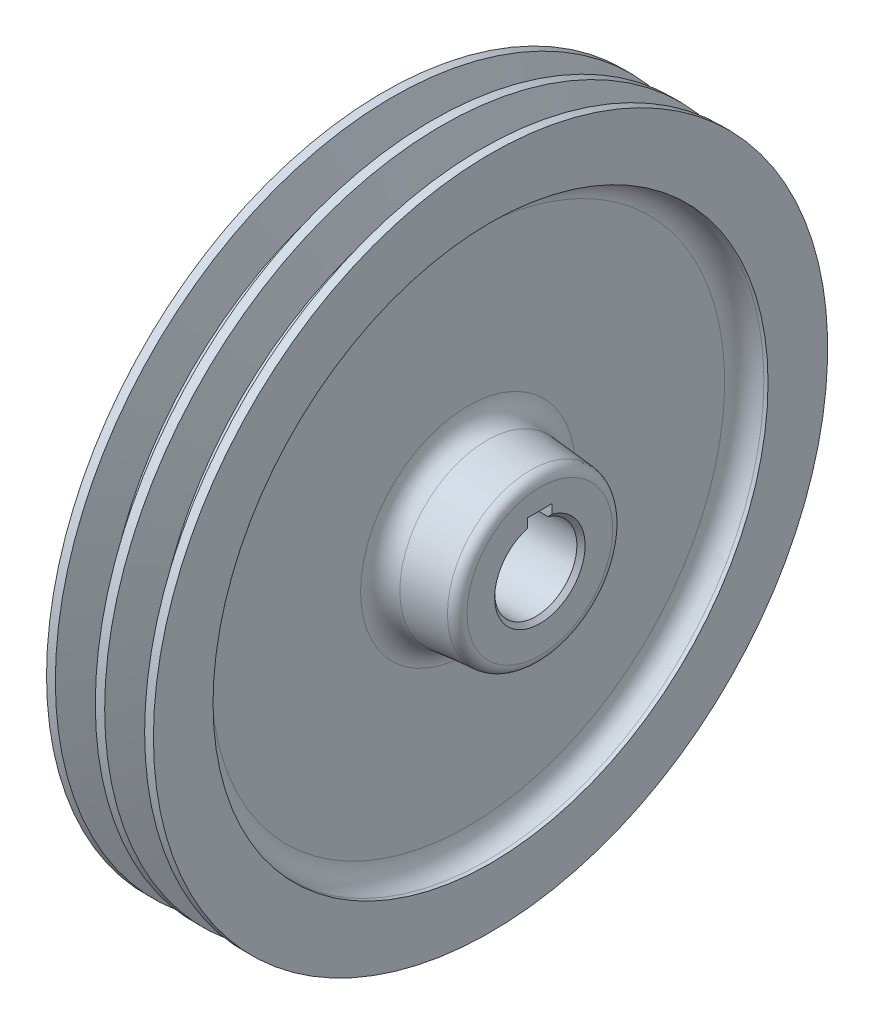
ISO-10303-21;
HEADER;
FILE_DESCRIPTION(('STEP AP214'),'2;1');
FILE_NAME('part.step','',(''),(''),'','','');
FILE_SCHEMA(('AUTOMOTIVE_DESIGN { 1 0 10303 214 1 1 1 1 }'));
ENDSEC;
DATA;
#1=APPLICATION_CONTEXT('core data for automotive mechanical design processes');
#2=APPLICATION_PROTOCOL_DEFINITION('international standard','automotive_design',2000,#1);
#3=PRODUCT_CONTEXT('',#1,'mechanical');
#4=PRODUCT('Part','Part','',(#3));
#5=PRODUCT_RELATED_PRODUCT_CATEGORY('part','',(#4));
#6=PRODUCT_DEFINITION_FORMATION('','',#4);
#7=PRODUCT_DEFINITION_CONTEXT('part definition',#1,'design');
#8=PRODUCT_DEFINITION('design','',#6,#7);
#9=PRODUCT_DEFINITION_SHAPE('','',#8);
#10=(LENGTH_UNIT() NAMED_UNIT(*) SI_UNIT(.MILLI.,.METRE.));
#11=(NAMED_UNIT(*) PLANE_ANGLE_UNIT() SI_UNIT($,.RADIAN.));
#12=(NAMED_UNIT(*) SI_UNIT($,.STERADIAN.) SOLID_ANGLE_UNIT());
#13=UNCERTAINTY_MEASURE_WITH_UNIT(LENGTH_MEASURE(1.E-05),#10,'distance_accuracy_value','');
#14=(GEOMETRIC_REPRESENTATION_CONTEXT(3) GLOBAL_UNCERTAINTY_ASSIGNED_CONTEXT((#13)) GLOBAL_UNIT_ASSIGNED_CONTEXT((#10,
#11,#12)) REPRESENTATION_CONTEXT('',''));
#15=CARTESIAN_POINT('',(0.,0.,0.));
#16=DIRECTION('',(0.,0.,1.));
#17=DIRECTION('',(1.,0.,0.));
#18=AXIS2_PLACEMENT_3D('',#15,#16,#17);
#19=CARTESIAN_POINT('',(0.,0.,0.));
#20=DIRECTION('',(-1.,0.,0.));
#21=DIRECTION('',(0.,0.,1.));
#22=AXIS2_PLACEMENT_3D('',#19,#20,#21);
#23=CYLINDRICAL_SURFACE('',#22,82.);
#24=CARTESIAN_POINT('',(26.,0.,0.));
#25=DIRECTION('',(-1.,0.,0.));
#26=DIRECTION('',(0.,0.,1.));
#27=AXIS2_PLACEMENT_3D('',#24,#25,#26);
#28=CIRCLE('',#27,82.);
#29=CARTESIAN_POINT('',(26.,0.,82.));
#30=VERTEX_POINT('',#29);
#31=EDGE_CURVE('E239',#30,#30,#28,.T.);
#32=ORIENTED_EDGE('',*,*,#31,.T.);
#33=EDGE_LOOP('',(#32));
#34=FACE_BOUND('',#33,.T.);
#35=CARTESIAN_POINT('',(23.8614613629173,0.,0.));
#36=DIRECTION('',(-1.,0.,0.));
#37=DIRECTION('',(0.,0.,1.));
#38=AXIS2_PLACEMENT_3D('',#35,#36,#37);
#39=CIRCLE('',#38,82.);
#40=CARTESIAN_POINT('',(23.8614613629173,0.,82.));
#41=VERTEX_POINT('',#40);
#42=EDGE_CURVE('E263',#41,#41,#39,.T.);
#43=ORIENTED_EDGE('',*,*,#42,.F.);
#44=EDGE_LOOP('',(#43));
#45=FACE_BOUND('',#44,.T.);
#46=ADVANCED_FACE('F37',(#34,#45),#23,.T.);
#47=CARTESIAN_POINT('',(11.8614613629173,0.,0.));
#48=DIRECTION('',(-1.,0.,0.));
#49=DIRECTION('',(0.,0.,1.));
#50=AXIS2_PLACEMENT_3D('',#47,#48,#49);
#51=CIRCLE('',#50,82.);
#52=CARTESIAN_POINT('',(11.8614613629173,0.,82.));
#53=VERTEX_POINT('',#52);
#54=EDGE_CURVE('E223',#53,#53,#51,.T.);
#55=ORIENTED_EDGE('',*,*,#54,.F.);
#56=EDGE_LOOP('',(#55));
#57=FACE_BOUND('',#56,.T.);
#58=CARTESIAN_POINT('',(14.1385386370827,0.,0.));
#59=DIRECTION('',(-1.,0.,0.));
#60=DIRECTION('',(0.,0.,1.));
#61=AXIS2_PLACEMENT_3D('',#58,#59,#60);
#62=CIRCLE('',#61,82.);
#63=CARTESIAN_POINT('',(14.1385386370827,0.,82.));
#64=VERTEX_POINT('',#63);
#65=EDGE_CURVE('E259',#64,#64,#62,.T.);
#66=ORIENTED_EDGE('',*,*,#65,.T.);
#67=EDGE_LOOP('',(#66));
#68=FACE_BOUND('',#67,.T.);
#69=ADVANCED_FACE('F195',(#57,#68),#23,.T.);
#70=CARTESIAN_POINT('',(0.,0.,0.));
#71=DIRECTION('',(-1.,0.,0.));
#72=DIRECTION('',(0.,0.,1.));
#73=AXIS2_PLACEMENT_3D('',#70,#71,#72);
#74=CIRCLE('',#73,82.);
#75=CARTESIAN_POINT('',(0.,0.,82.));
#76=VERTEX_POINT('',#75);
#77=EDGE_CURVE('E218',#76,#76,#74,.T.);
#78=ORIENTED_EDGE('',*,*,#77,.F.);
#79=EDGE_LOOP('',(#78));
#80=FACE_BOUND('',#79,.T.);
#81=CARTESIAN_POINT('',(2.13853863708269,0.,0.));
#82=DIRECTION('',(-1.,0.,0.));
#83=DIRECTION('',(0.,0.,1.));
#84=AXIS2_PLACEMENT_3D('',#81,#82,#83);
#85=CIRCLE('',#84,82.);
#86=CARTESIAN_POINT('',(2.13853863708269,0.,82.));
#87=VERTEX_POINT('',#86);
#88=EDGE_CURVE('E221',#87,#87,#85,.T.);
#89=ORIENTED_EDGE('',*,*,#88,.T.);
#90=EDGE_LOOP('',(#89));
#91=FACE_BOUND('',#90,.T.);
#92=ADVANCED_FACE('F198',(#80,#91),#23,.T.);
#93=CARTESIAN_POINT('',(0.,0.,0.));
#94=DIRECTION('',(-1.,0.,0.));
#95=DIRECTION('',(0.,0.,1.));
#96=AXIS2_PLACEMENT_3D('',#93,#94,#95);
#97=CYLINDRICAL_SURFACE('',#96,9.99999999999999);
#98=CARTESIAN_POINT('',(-11.,0.,0.));
#99=DIRECTION('',(1.,0.,0.));
#100=DIRECTION('',(0.,0.,-1.));
#101=AXIS2_PLACEMENT_3D('',#98,#99,#100);
#102=CIRCLE('',#101,9.99999999999999);
#103=CARTESIAN_POINT('',(-11.,9.53939201416945,-3.));
#104=VERTEX_POINT('',#103);
#105=CARTESIAN_POINT('',(-11.,9.53939201416945,3.));
#106=VERTEX_POINT('',#105);
#107=EDGE_CURVE('E248',#104,#106,#102,.F.);
#108=ORIENTED_EDGE('',*,*,#107,.T.);
#109=DIRECTION('',(-1.,0.,0.));
#110=VECTOR('',#109,1.);
#111=CARTESIAN_POINT('',(38.,9.53939201416945,3.));
#112=LINE('',#111,#110);
#113=CARTESIAN_POINT('',(37.,9.53939201416945,3.));
#114=VERTEX_POINT('',#113);
#115=EDGE_CURVE('E97',#114,#106,#112,.T.);
#116=ORIENTED_EDGE('',*,*,#115,.F.);
#117=CARTESIAN_POINT('',(37.,0.,0.));
#118=DIRECTION('',(-1.,0.,0.));
#119=DIRECTION('',(0.,0.,1.));
#120=AXIS2_PLACEMENT_3D('',#117,#118,#119);
#121=CIRCLE('',#120,9.99999999999999);
#122=CARTESIAN_POINT('',(37.,9.53939201416945,-3.));
#123=VERTEX_POINT('',#122);
#124=EDGE_CURVE('E245',#114,#123,#121,.F.);
#125=ORIENTED_EDGE('',*,*,#124,.T.);
#126=DIRECTION('',(-1.,0.,0.));
#127=VECTOR('',#126,1.);
#128=CARTESIAN_POINT('',(38.,9.53939201416945,-3.));
#129=LINE('',#128,#127);
#130=EDGE_CURVE('E105',#123,#104,#129,.T.);
#131=ORIENTED_EDGE('',*,*,#130,.T.);
#132=EDGE_LOOP('',(#108,#116,#125,#131));
#133=FACE_BOUND('',#132,.T.);
#134=ADVANCED_FACE('F208',(#133),#97,.F.);
#135=CARTESIAN_POINT('',(-12.,9.99999999999999,0.));
#136=DIRECTION('',(1.,0.,0.));
#137=DIRECTION('',(0.,0.,-1.));
#138=AXIS2_PLACEMENT_3D('',#135,#136,#137);
#139=PLANE('',#138);
#140=CARTESIAN_POINT('',(-12.,0.,0.));
#141=DIRECTION('',(1.,0.,0.));
#142=DIRECTION('',(0.,0.,-1.));
#143=AXIS2_PLACEMENT_3D('',#140,#141,#142);
#144=CIRCLE('',#143,17.7091720649564);
#145=CARTESIAN_POINT('',(-12.,0.,-17.7091720649564));
#146=VERTEX_POINT('',#145);
#147=EDGE_CURVE('E45',#146,#146,#144,.F.);
#148=ORIENTED_EDGE('',*,*,#147,.T.);
#149=EDGE_LOOP('',(#148));
#150=FACE_BOUND('',#149,.T.);
#151=CARTESIAN_POINT('',(-12.,0.,0.));
#152=DIRECTION('',(1.,0.,0.));
#153=DIRECTION('',(0.,0.,-1.));
#154=AXIS2_PLACEMENT_3D('',#151,#152,#153);
#155=CIRCLE('',#154,11.);
#156=CARTESIAN_POINT('',(-12.,10.5830052442583,3.));
#157=VERTEX_POINT('',#156);
#158=CARTESIAN_POINT('',(-12.,10.5830052442583,-3.));
#159=VERTEX_POINT('',#158);
#160=EDGE_CURVE('E250',#157,#159,#155,.T.);
#161=ORIENTED_EDGE('',*,*,#160,.T.);
#162=DIRECTION('',(0.,-1.,0.));
#163=VECTOR('',#162,1.);
#164=CARTESIAN_POINT('',(-12.,9.53939201416945,-3.));
#165=LINE('',#164,#163);
#166=CARTESIAN_POINT('',(-12.,12.799999952316,-3.));
#167=VERTEX_POINT('',#166);
#168=EDGE_CURVE('E60',#167,#159,#165,.T.);
#169=ORIENTED_EDGE('',*,*,#168,.F.);
#170=DIRECTION('',(0.,0.,-1.));
#171=VECTOR('',#170,1.);
#172=CARTESIAN_POINT('',(-12.,12.799999952316,-3.));
#173=LINE('',#172,#171);
#174=CARTESIAN_POINT('',(-12.,12.799999952316,3.));
#175=VERTEX_POINT('',#174);
#176=EDGE_CURVE('E113',#175,#167,#173,.T.);
#177=ORIENTED_EDGE('',*,*,#176,.F.);
#178=DIRECTION('',(0.,1.,0.));
#179=VECTOR('',#178,1.);
#180=CARTESIAN_POINT('',(-12.,9.53939201416945,3.));
#181=LINE('',#180,#179);
#182=EDGE_CURVE('E92',#157,#175,#181,.T.);
#183=ORIENTED_EDGE('',*,*,#182,.F.);
#184=EDGE_LOOP('',(#161,#169,#177,#183));
#185=FACE_BOUND('',#184,.T.);
#186=ADVANCED_FACE('F213',(#150,#185),#139,.F.);
#187=CARTESIAN_POINT('',(5.5,0.,0.));
#188=DIRECTION('',(1.,0.,0.));
#189=DIRECTION('',(0.,0.,-1.));
#190=AXIS2_PLACEMENT_3D('',#187,#188,#189);
#191=CONICAL_SURFACE('',#190,21.5310516117034,0.0872664625997024);
#192=CARTESIAN_POINT('',(-9.7178893568691,0.,0.));
#193=DIRECTION('',(-1.,0.,0.));
#194=DIRECTION('',(0.,0.,1.));
#195=AXIS2_PLACEMENT_3D('',#192,#193,#194);
#196=CIRCLE('',#195,20.1996588101858);
#197=CARTESIAN_POINT('',(-9.7178893568691,0.,20.1996588101858));
#198=VERTEX_POINT('',#197);
#199=EDGE_CURVE('E11',#198,#198,#196,.F.);
#200=ORIENTED_EDGE('',*,*,#199,.T.);
#201=EDGE_LOOP('',(#200));
#202=FACE_BOUND('',#201,.T.);
#203=CARTESIAN_POINT('',(0.935778713738219,0.,0.));
#204=DIRECTION('',(1.,0.,0.));
#205=DIRECTION('',(0.,0.,-1.));
#206=AXIS2_PLACEMENT_3D('',#203,#204,#205);
#207=CIRCLE('',#206,21.1317339913319);
#208=CARTESIAN_POINT('',(0.935778713738219,0.,-21.1317339913319));
#209=VERTEX_POINT('',#208);
#210=EDGE_CURVE('E373',#209,#209,#207,.F.);
#211=ORIENTED_EDGE('',*,*,#210,.T.);
#212=EDGE_LOOP('',(#211));
#213=FACE_BOUND('',#212,.T.);
#214=ADVANCED_FACE('F334',(#202,#213),#191,.T.);
#215=CARTESIAN_POINT('',(5.5,21.5310516117034,0.));
#216=DIRECTION('',(1.,0.,0.));
#217=DIRECTION('',(0.,0.,-1.));
#218=AXIS2_PLACEMENT_3D('',#215,#216,#217);
#219=PLANE('',#218);
#220=CARTESIAN_POINT('',(5.5,0.,0.));
#221=DIRECTION('',(1.,0.,0.));
#222=DIRECTION('',(0.,0.,-1.));
#223=AXIS2_PLACEMENT_3D('',#220,#221,#222);
#224=CIRCLE('',#223,26.1127074817906);
#225=CARTESIAN_POINT('',(5.5,0.,-26.1127074817906));
#226=VERTEX_POINT('',#225);
#227=EDGE_CURVE('E368',#226,#226,#224,.T.);
#228=ORIENTED_EDGE('',*,*,#227,.T.);
#229=EDGE_LOOP('',(#228));
#230=FACE_BOUND('',#229,.T.);
#231=CARTESIAN_POINT('',(5.5,0.,0.));
#232=DIRECTION('',(1.,0.,0.));
#233=DIRECTION('',(0.,0.,-1.));
#234=AXIS2_PLACEMENT_3D('',#231,#232,#233);
#235=CIRCLE('',#234,62.4371564805203);
#236=CARTESIAN_POINT('',(5.5,0.,-62.4371564805203));
#237=VERTEX_POINT('',#236);
#238=EDGE_CURVE('E371',#237,#237,#235,.F.);
#239=ORIENTED_EDGE('',*,*,#238,.T.);
#240=EDGE_LOOP('',(#239));
#241=FACE_BOUND('',#240,.T.);
#242=ADVANCED_FACE('F326',(#230,#241),#219,.F.);
#243=CARTESIAN_POINT('',(0.,0.,0.));
#244=DIRECTION('',(-1.,0.,0.));
#245=DIRECTION('',(0.,0.,1.));
#246=AXIS2_PLACEMENT_3D('',#243,#244,#245);
#247=CONICAL_SURFACE('',#246,67.5,0.0872664625997178);
#248=CARTESIAN_POINT('',(0.935778713738297,0.,0.));
#249=DIRECTION('',(-1.,0.,0.));
#250=DIRECTION('',(0.,0.,1.));
#251=AXIS2_PLACEMENT_3D('',#248,#249,#250);
#252=CIRCLE('',#251,67.418129970979);
#253=CARTESIAN_POINT('',(0.935778713738297,0.,67.418129970979));
#254=VERTEX_POINT('',#253);
#255=EDGE_CURVE('E365',#254,#254,#252,.F.);
#256=ORIENTED_EDGE('',*,*,#255,.T.);
#257=EDGE_LOOP('',(#256));
#258=FACE_BOUND('',#257,.T.);
#259=CARTESIAN_POINT('',(0.,0.,0.));
#260=DIRECTION('',(-1.,0.,0.));
#261=DIRECTION('',(0.,0.,1.));
#262=AXIS2_PLACEMENT_3D('',#259,#260,#261);
#263=CIRCLE('',#262,67.5);
#264=CARTESIAN_POINT('',(0.,0.,67.5));
#265=VERTEX_POINT('',#264);
#266=EDGE_CURVE('E242',#265,#265,#263,.T.);
#267=ORIENTED_EDGE('',*,*,#266,.T.);
#268=EDGE_LOOP('',(#267));
#269=FACE_BOUND('',#268,.T.);
#270=ADVANCED_FACE('F317',(#258,#269),#247,.F.);
#271=CARTESIAN_POINT('',(0.,67.5,0.));
#272=DIRECTION('',(1.,0.,0.));
#273=DIRECTION('',(0.,0.,-1.));
#274=AXIS2_PLACEMENT_3D('',#271,#272,#273);
#275=PLANE('',#274);
#276=ORIENTED_EDGE('',*,*,#266,.F.);
#277=EDGE_LOOP('',(#276));
#278=FACE_BOUND('',#277,.T.);
#279=ORIENTED_EDGE('',*,*,#77,.T.);
#280=EDGE_LOOP('',(#279));
#281=FACE_BOUND('',#280,.T.);
#282=ADVANCED_FACE('F312',(#278,#281),#275,.F.);
#283=CARTESIAN_POINT('',(26.,82.,0.));
#284=DIRECTION('',(-1.,0.,0.));
#285=DIRECTION('',(0.,0.,1.));
#286=AXIS2_PLACEMENT_3D('',#283,#284,#285);
#287=PLANE('',#286);
#288=ORIENTED_EDGE('',*,*,#31,.F.);
#289=EDGE_LOOP('',(#288));
#290=FACE_BOUND('',#289,.T.);
#291=CARTESIAN_POINT('',(26.,0.,0.));
#292=DIRECTION('',(-1.,0.,0.));
#293=DIRECTION('',(0.,0.,1.));
#294=AXIS2_PLACEMENT_3D('',#291,#292,#293);
#295=CIRCLE('',#294,67.5);
#296=CARTESIAN_POINT('',(26.,0.,67.5));
#297=VERTEX_POINT('',#296);
#298=EDGE_CURVE('E236',#297,#297,#295,.T.);
#299=ORIENTED_EDGE('',*,*,#298,.T.);
#300=EDGE_LOOP('',(#299));
#301=FACE_BOUND('',#300,.T.);
#302=ADVANCED_FACE('F309',(#290,#301),#287,.F.);
#303=CARTESIAN_POINT('',(20.5,0.,0.));
#304=DIRECTION('',(1.,0.,0.));
#305=DIRECTION('',(0.,0.,-1.));
#306=AXIS2_PLACEMENT_3D('',#303,#304,#305);
#307=CONICAL_SURFACE('',#306,67.0188123506075,0.0872664625997027);
#308=CARTESIAN_POINT('',(25.0642212862618,0.,0.));
#309=DIRECTION('',(1.,0.,0.));
#310=DIRECTION('',(0.,0.,-1.));
#311=AXIS2_PLACEMENT_3D('',#308,#309,#310);
#312=CIRCLE('',#311,67.4181299709791);
#313=CARTESIAN_POINT('',(25.0642212862618,0.,-67.4181299709791));
#314=VERTEX_POINT('',#313);
#315=EDGE_CURVE('E353',#314,#314,#312,.F.);
#316=ORIENTED_EDGE('',*,*,#315,.T.);
#317=EDGE_LOOP('',(#316));
#318=FACE_BOUND('',#317,.T.);
#319=ORIENTED_EDGE('',*,*,#298,.F.);
#320=EDGE_LOOP('',(#319));
#321=FACE_BOUND('',#320,.T.);
#322=ADVANCED_FACE('F306',(#318,#321),#307,.F.);
#323=CARTESIAN_POINT('',(20.5,67.0188123506075,0.));
#324=DIRECTION('',(-1.,0.,0.));
#325=DIRECTION('',(0.,0.,1.));
#326=AXIS2_PLACEMENT_3D('',#323,#324,#325);
#327=PLANE('',#326);
#328=CARTESIAN_POINT('',(20.5,0.,0.));
#329=DIRECTION('',(-1.,0.,0.));
#330=DIRECTION('',(0.,0.,1.));
#331=AXIS2_PLACEMENT_3D('',#328,#329,#330);
#332=CIRCLE('',#331,26.1127074817908);
#333=CARTESIAN_POINT('',(20.5,0.,26.1127074817908));
#334=VERTEX_POINT('',#333);
#335=EDGE_CURVE('E359',#334,#334,#332,.T.);
#336=ORIENTED_EDGE('',*,*,#335,.T.);
#337=EDGE_LOOP('',(#336));
#338=FACE_BOUND('',#337,.T.);
#339=CARTESIAN_POINT('',(20.5,0.,0.));
#340=DIRECTION('',(-1.,0.,0.));
#341=DIRECTION('',(0.,0.,1.));
#342=AXIS2_PLACEMENT_3D('',#339,#340,#341);
#343=CIRCLE('',#342,62.4371564805203);
#344=CARTESIAN_POINT('',(20.5,0.,62.4371564805203));
#345=VERTEX_POINT('',#344);
#346=EDGE_CURVE('E362',#345,#345,#343,.F.);
#347=ORIENTED_EDGE('',*,*,#346,.T.);
#348=EDGE_LOOP('',(#347));
#349=FACE_BOUND('',#348,.T.);
#350=ADVANCED_FACE('F302',(#338,#349),#327,.F.);
#351=CARTESIAN_POINT('',(38.,0.,0.));
#352=DIRECTION('',(-1.,0.,0.));
#353=DIRECTION('',(0.,0.,1.));
#354=AXIS2_PLACEMENT_3D('',#351,#352,#353);
#355=CONICAL_SURFACE('',#354,20.,0.0872664625997164);
#356=CARTESIAN_POINT('',(35.7178893568692,0.,0.));
#357=DIRECTION('',(1.,0.,0.));
#358=DIRECTION('',(0.,0.,-1.));
#359=AXIS2_PLACEMENT_3D('',#356,#357,#358);
#360=CIRCLE('',#359,20.1996588101858);
#361=CARTESIAN_POINT('',(35.7178893568692,0.,-20.1996588101858));
#362=VERTEX_POINT('',#361);
#363=EDGE_CURVE('E348',#362,#362,#360,.F.);
#364=ORIENTED_EDGE('',*,*,#363,.T.);
#365=EDGE_LOOP('',(#364));
#366=FACE_BOUND('',#365,.T.);
#367=CARTESIAN_POINT('',(25.0642212862617,0.,0.));
#368=DIRECTION('',(-1.,0.,0.));
#369=DIRECTION('',(0.,0.,1.));
#370=AXIS2_PLACEMENT_3D('',#367,#368,#369);
#371=CIRCLE('',#370,21.1317339913321);
#372=CARTESIAN_POINT('',(25.0642212862617,0.,21.1317339913321));
#373=VERTEX_POINT('',#372);
#374=EDGE_CURVE('E356',#373,#373,#371,.F.);
#375=ORIENTED_EDGE('',*,*,#374,.T.);
#376=EDGE_LOOP('',(#375));
#377=FACE_BOUND('',#376,.T.);
#378=ADVANCED_FACE('F298',(#366,#377),#355,.T.);
#379=CARTESIAN_POINT('',(38.,20.,0.));
#380=DIRECTION('',(-1.,0.,0.));
#381=DIRECTION('',(0.,0.,1.));
#382=AXIS2_PLACEMENT_3D('',#379,#380,#381);
#383=PLANE('',#382);
#384=CARTESIAN_POINT('',(38.,0.,0.));
#385=DIRECTION('',(-1.,0.,0.));
#386=DIRECTION('',(0.,0.,1.));
#387=AXIS2_PLACEMENT_3D('',#384,#385,#386);
#388=CIRCLE('',#387,17.7091720649564);
#389=CARTESIAN_POINT('',(38.,0.,17.7091720649564));
#390=VERTEX_POINT('',#389);
#391=EDGE_CURVE('E346',#390,#390,#388,.F.);
#392=ORIENTED_EDGE('',*,*,#391,.T.);
#393=EDGE_LOOP('',(#392));
#394=FACE_BOUND('',#393,.T.);
#395=DIRECTION('',(0.,0.,-1.));
#396=VECTOR('',#395,1.);
#397=CARTESIAN_POINT('',(38.,12.799999952316,-3.));
#398=LINE('',#397,#396);
#399=CARTESIAN_POINT('',(38.,12.799999952316,3.));
#400=VERTEX_POINT('',#399);
#401=CARTESIAN_POINT('',(38.,12.799999952316,-3.));
#402=VERTEX_POINT('',#401);
#403=EDGE_CURVE('E100',#400,#402,#398,.T.);
#404=ORIENTED_EDGE('',*,*,#403,.T.);
#405=DIRECTION('',(0.,-1.,0.));
#406=VECTOR('',#405,1.);
#407=CARTESIAN_POINT('',(38.,9.53939201416945,-3.));
#408=LINE('',#407,#406);
#409=CARTESIAN_POINT('',(38.,10.5830052442583,-3.));
#410=VERTEX_POINT('',#409);
#411=EDGE_CURVE('E111',#402,#410,#408,.T.);
#412=ORIENTED_EDGE('',*,*,#411,.T.);
#413=CARTESIAN_POINT('',(38.,0.,0.));
#414=DIRECTION('',(-1.,0.,0.));
#415=DIRECTION('',(0.,0.,1.));
#416=AXIS2_PLACEMENT_3D('',#413,#414,#415);
#417=CIRCLE('',#416,11.);
#418=CARTESIAN_POINT('',(38.,10.5830052442583,3.));
#419=VERTEX_POINT('',#418);
#420=EDGE_CURVE('E110',#410,#419,#417,.T.);
#421=ORIENTED_EDGE('',*,*,#420,.T.);
#422=DIRECTION('',(0.,1.,0.));
#423=VECTOR('',#422,1.);
#424=CARTESIAN_POINT('',(38.,9.53939201416945,3.));
#425=LINE('',#424,#423);
#426=EDGE_CURVE('E52',#419,#400,#425,.T.);
#427=ORIENTED_EDGE('',*,*,#426,.T.);
#428=EDGE_LOOP('',(#404,#412,#421,#427));
#429=FACE_BOUND('',#428,.T.);
#430=ADVANCED_FACE('F108',(#394,#429),#383,.F.);
#431=CARTESIAN_POINT('',(0.,0.,0.));
#432=DIRECTION('',(-1.,0.,0.));
#433=DIRECTION('',(0.,0.,1.));
#434=AXIS2_PLACEMENT_3D('',#431,#432,#433);
#435=CYLINDRICAL_SURFACE('',#434,73.);
#436=CARTESIAN_POINT('',(9.10988522978941,0.,0.));
#437=DIRECTION('',(-1.,0.,0.));
#438=DIRECTION('',(0.,0.,1.));
#439=AXIS2_PLACEMENT_3D('',#436,#437,#438);
#440=CIRCLE('',#439,73.);
#441=CARTESIAN_POINT('',(9.10988522978941,0.,73.));
#442=VERTEX_POINT('',#441);
#443=EDGE_CURVE('E227',#442,#442,#440,.T.);
#444=ORIENTED_EDGE('',*,*,#443,.T.);
#445=EDGE_LOOP('',(#444));
#446=FACE_BOUND('',#445,.T.);
#447=CARTESIAN_POINT('',(4.89011477021061,0.,0.));
#448=DIRECTION('',(-1.,0.,0.));
#449=DIRECTION('',(0.,0.,1.));
#450=AXIS2_PLACEMENT_3D('',#447,#448,#449);
#451=CIRCLE('',#450,73.);
#452=CARTESIAN_POINT('',(4.89011477021061,0.,73.));
#453=VERTEX_POINT('',#452);
#454=EDGE_CURVE('E224',#453,#453,#451,.T.);
#455=ORIENTED_EDGE('',*,*,#454,.F.);
#456=EDGE_LOOP('',(#455));
#457=FACE_BOUND('',#456,.T.);
#458=ADVANCED_FACE('F291',(#446,#457),#435,.T.);
#459=CARTESIAN_POINT('',(9.10988522978941,0.,0.));
#460=DIRECTION('',(1.,0.,0.));
#461=DIRECTION('',(0.,0.,-1.));
#462=AXIS2_PLACEMENT_3D('',#459,#460,#461);
#463=CONICAL_SURFACE('',#462,73.,1.27409035395586);
#464=ORIENTED_EDGE('',*,*,#54,.T.);
#465=EDGE_LOOP('',(#464));
#466=FACE_BOUND('',#465,.T.);
#467=ORIENTED_EDGE('',*,*,#443,.F.);
#468=EDGE_LOOP('',(#467));
#469=FACE_BOUND('',#468,.T.);
#470=ADVANCED_FACE('F287',(#466,#469),#463,.T.);
#471=CARTESIAN_POINT('',(2.13853863708269,0.,0.));
#472=DIRECTION('',(-1.,0.,0.));
#473=DIRECTION('',(0.,0.,1.));
#474=AXIS2_PLACEMENT_3D('',#471,#472,#473);
#475=CONICAL_SURFACE('',#474,82.,1.27409035395586);
#476=ORIENTED_EDGE('',*,*,#454,.T.);
#477=EDGE_LOOP('',(#476));
#478=FACE_BOUND('',#477,.T.);
#479=ORIENTED_EDGE('',*,*,#88,.F.);
#480=EDGE_LOOP('',(#479));
#481=FACE_BOUND('',#480,.T.);
#482=ADVANCED_FACE('F282',(#478,#481),#475,.T.);
#483=CARTESIAN_POINT('',(12.,0.,0.));
#484=DIRECTION('',(-1.,0.,0.));
#485=DIRECTION('',(0.,0.,1.));
#486=AXIS2_PLACEMENT_3D('',#483,#484,#485);
#487=CYLINDRICAL_SURFACE('',#486,73.);
#488=CARTESIAN_POINT('',(21.1098852297894,0.,0.));
#489=DIRECTION('',(-1.,0.,0.));
#490=DIRECTION('',(0.,0.,1.));
#491=AXIS2_PLACEMENT_3D('',#488,#489,#490);
#492=CIRCLE('',#491,73.);
#493=CARTESIAN_POINT('',(21.1098852297894,0.,73.));
#494=VERTEX_POINT('',#493);
#495=EDGE_CURVE('E230',#494,#494,#492,.T.);
#496=ORIENTED_EDGE('',*,*,#495,.T.);
#497=EDGE_LOOP('',(#496));
#498=FACE_BOUND('',#497,.T.);
#499=CARTESIAN_POINT('',(16.8901147702106,0.,0.));
#500=DIRECTION('',(-1.,0.,0.));
#501=DIRECTION('',(0.,0.,1.));
#502=AXIS2_PLACEMENT_3D('',#499,#500,#501);
#503=CIRCLE('',#502,73.);
#504=CARTESIAN_POINT('',(16.8901147702106,0.,73.));
#505=VERTEX_POINT('',#504);
#506=EDGE_CURVE('E257',#505,#505,#503,.T.);
#507=ORIENTED_EDGE('',*,*,#506,.F.);
#508=EDGE_LOOP('',(#507));
#509=FACE_BOUND('',#508,.T.);
#510=ADVANCED_FACE('F270',(#498,#509),#487,.T.);
#511=CARTESIAN_POINT('',(21.1098852297894,0.,0.));
#512=DIRECTION('',(1.,0.,0.));
#513=DIRECTION('',(0.,0.,-1.));
#514=AXIS2_PLACEMENT_3D('',#511,#512,#513);
#515=CONICAL_SURFACE('',#514,73.,1.27409035395586);
#516=ORIENTED_EDGE('',*,*,#42,.T.);
#517=EDGE_LOOP('',(#516));
#518=FACE_BOUND('',#517,.T.);
#519=ORIENTED_EDGE('',*,*,#495,.F.);
#520=EDGE_LOOP('',(#519));
#521=FACE_BOUND('',#520,.T.);
#522=ADVANCED_FACE('F273',(#518,#521),#515,.T.);
#523=CARTESIAN_POINT('',(14.1385386370827,0.,0.));
#524=DIRECTION('',(-1.,0.,0.));
#525=DIRECTION('',(0.,0.,1.));
#526=AXIS2_PLACEMENT_3D('',#523,#524,#525);
#527=CONICAL_SURFACE('',#526,82.,1.27409035395586);
#528=ORIENTED_EDGE('',*,*,#506,.T.);
#529=EDGE_LOOP('',(#528));
#530=FACE_BOUND('',#529,.T.);
#531=ORIENTED_EDGE('',*,*,#65,.F.);
#532=EDGE_LOOP('',(#531));
#533=FACE_BOUND('',#532,.T.);
#534=ADVANCED_FACE('F275',(#530,#533),#527,.T.);
#535=CARTESIAN_POINT('',(-11.,0.,0.));
#536=DIRECTION('',(-1.,0.,0.));
#537=DIRECTION('',(0.,0.,1.));
#538=AXIS2_PLACEMENT_3D('',#535,#536,#537);
#539=CONICAL_SURFACE('',#538,9.99999999999999,0.785398163397441);
#540=CARTESIAN_POINT('',(-14.0010616306219,12.6502017186774,-3.));
#541=CARTESIAN_POINT('',(-13.8030033648417,12.4466487731702,-3.));
#542=CARTESIAN_POINT('',(-13.605074155322,12.2429703490017,-3.));
#543=CARTESIAN_POINT('',(-13.2095185963236,11.8353189056375,-3.));
#544=CARTESIAN_POINT('',(-13.0118922474144,11.6313458858895,-3.));
#545=CARTESIAN_POINT('',(-12.419546453618,11.018931712465,-3.));
#546=CARTESIAN_POINT('',(-12.0253494984335,10.6099843925142,-3.));
#547=CARTESIAN_POINT('',(-11.4355108001854,9.99515885911992,-3.));
#548=CARTESIAN_POINT('',(-11.2391389179217,9.78998105776214,-3.));
#549=CARTESIAN_POINT('',(-10.8469833901662,9.37906454642822,-3.));
#550=CARTESIAN_POINT('',(-10.6511997436886,9.17332583739324,-3.));
#551=CARTESIAN_POINT('',(-10.2603357313829,8.76117092237421,-3.));
#552=CARTESIAN_POINT('',(-10.0652553837406,8.55475469913099,-3.));
#553=CARTESIAN_POINT('',(-9.67597549650592,8.14109128560574,-3.));
#554=CARTESIAN_POINT('',(-9.48177596213116,7.93384409041496,-3.));
#555=CARTESIAN_POINT('',(-9.2881042267005,7.72610326572529,-3.));
#556=B_SPLINE_CURVE_WITH_KNOTS('',3,(#540,#541,#542,#543,#544,#545,#546,#547,#548,#549,#550,
#551,#552,#553,#554,#555),.UNSPECIFIED.,.F.,.F.,(4,2,2,2,2,2,2,4),(0.,0.852025523285059,
1.70405264643822,3.40806061156877,4.26008002768959,5.11209801505455,5.96413787805233,
6.81618278169277),.UNSPECIFIED.);
#557=EDGE_CURVE('E131',#159,#104,#556,.T.);
#558=ORIENTED_EDGE('',*,*,#557,.F.);
#559=ORIENTED_EDGE('',*,*,#160,.F.);
#560=CARTESIAN_POINT('',(-9.2881042267005,7.72610326572529,3.));
#561=CARTESIAN_POINT('',(-9.48177596213116,7.93384409041496,3.));
#562=CARTESIAN_POINT('',(-9.67597549650592,8.14109128560574,3.));
#563=CARTESIAN_POINT('',(-10.0652553837406,8.55475469913099,3.));
#564=CARTESIAN_POINT('',(-10.2603357313829,8.76117092237421,3.));
#565=CARTESIAN_POINT('',(-10.6511997436886,9.17332583739324,3.));
#566=CARTESIAN_POINT('',(-10.8469833901662,9.37906454642822,3.));
#567=CARTESIAN_POINT('',(-11.2391389179217,9.78998105776215,3.));
#568=CARTESIAN_POINT('',(-11.4355108001854,9.99515885911992,3.));
#569=CARTESIAN_POINT('',(-12.0253494984335,10.6099843925142,3.));
#570=CARTESIAN_POINT('',(-12.419546453618,11.018931712465,3.));
#571=CARTESIAN_POINT('',(-13.0118922474144,11.6313458858895,3.));
#572=CARTESIAN_POINT('',(-13.2095185963236,11.8353189056375,3.));
#573=CARTESIAN_POINT('',(-13.605074155322,12.2429703490017,3.));
#574=CARTESIAN_POINT('',(-13.8030033648417,12.4466487731702,3.));
#575=CARTESIAN_POINT('',(-14.0010616306219,12.6502017186774,3.));
#576=B_SPLINE_CURVE_WITH_KNOTS('',3,(#560,#561,#562,#563,#564,#565,#566,#567,#568,#569,#570,
#571,#572,#573,#574,#575),.UNSPECIFIED.,.F.,.F.,(4,2,2,2,2,2,2,4),(0.,0.852044903640432,
1.70408476663821,2.55610275400317,3.40812217012399,5.11213013525454,5.96415725840771,
6.81618278169277),.UNSPECIFIED.);
#577=EDGE_CURVE('E119',#106,#157,#576,.T.);
#578=ORIENTED_EDGE('',*,*,#577,.F.);
#579=ORIENTED_EDGE('',*,*,#107,.F.);
#580=EDGE_LOOP('',(#558,#559,#578,#579));
#581=FACE_BOUND('',#580,.T.);
#582=ADVANCED_FACE('F138',(#581),#539,.F.);
#583=CARTESIAN_POINT('',(38.,0.,0.));
#584=DIRECTION('',(1.,0.,0.));
#585=DIRECTION('',(0.,0.,-1.));
#586=AXIS2_PLACEMENT_3D('',#583,#584,#585);
#587=CONICAL_SURFACE('',#586,11.,0.785398163397441);
#588=CARTESIAN_POINT('',(34.8732473832478,7.27928735233184,-3.));
#589=CARTESIAN_POINT('',(35.0660716864807,7.48782105642136,-3.));
#590=CARTESIAN_POINT('',(35.2595187803121,7.69577664481241,-3.));
#591=CARTESIAN_POINT('',(35.6474436640861,8.11072135746676,-3.));
#592=CARTESIAN_POINT('',(35.8419214455091,8.31771048969209,-3.));
#593=CARTESIAN_POINT('',(36.2316894861697,8.73090857789431,-3.));
#594=CARTESIAN_POINT('',(36.4269797179952,8.93711755975227,-3.));
#595=CARTESIAN_POINT('',(36.8182345395691,9.3488954507339,-3.));
#596=CARTESIAN_POINT('',(37.0141991308994,9.55446435835374,-3.));
#597=CARTESIAN_POINT('',(37.6029128526146,10.1703680744198,-3.));
#598=CARTESIAN_POINT('',(37.9964915156567,10.5799100124604,-3.));
#599=CARTESIAN_POINT('',(38.5880371079314,11.1930987814205,-3.));
#600=CARTESIAN_POINT('',(38.7854187371931,11.3973112806608,-3.));
#601=CARTESIAN_POINT('',(39.1805196444048,11.805408441618,-3.));
#602=CARTESIAN_POINT('',(39.3782389215257,12.0092931041375,-3.));
#603=CARTESIAN_POINT('',(39.5761012127097,12.2130390039628,-3.));
#604=B_SPLINE_CURVE_WITH_KNOTS('',3,(#588,#589,#590,#591,#592,#593,#594,#595,#596,#597,#598,
#599,#600,#601,#602,#603),.UNSPECIFIED.,.F.,.F.,(4,2,2,2,2,2,2,4),(0.,0.852057183679752,
1.70410733536306,2.55612896841235,3.40815260171882,5.11215801736264,5.96419084298408,
6.81622157941967),.UNSPECIFIED.);
#605=EDGE_CURVE('E158',#123,#410,#604,.T.);
#606=ORIENTED_EDGE('',*,*,#605,.F.);
#607=ORIENTED_EDGE('',*,*,#124,.F.);
#608=CARTESIAN_POINT('',(39.5761012127097,12.2130390039628,3.));
#609=CARTESIAN_POINT('',(39.3782389215257,12.0092931041375,3.));
#610=CARTESIAN_POINT('',(39.1805196444048,11.805408441618,3.));
#611=CARTESIAN_POINT('',(38.7854187371932,11.3973112806608,3.));
#612=CARTESIAN_POINT('',(38.5880371079314,11.1930987814205,3.));
#613=CARTESIAN_POINT('',(37.9964915156567,10.5799100124604,3.));
#614=CARTESIAN_POINT('',(37.6029128526146,10.1703680744198,3.));
#615=CARTESIAN_POINT('',(37.0141991308994,9.55446435835374,3.));
#616=CARTESIAN_POINT('',(36.8182345395691,9.34889545073389,3.));
#617=CARTESIAN_POINT('',(36.4269797179952,8.93711755975227,3.));
#618=CARTESIAN_POINT('',(36.2316894861697,8.73090857789431,3.));
#619=CARTESIAN_POINT('',(35.8419214455091,8.31771048969209,3.));
#620=CARTESIAN_POINT('',(35.6474436640861,8.11072135746675,3.));
#621=CARTESIAN_POINT('',(35.2595187803121,7.6957766448124,3.));
#622=CARTESIAN_POINT('',(35.0660716864807,7.48782105642136,3.));
#623=CARTESIAN_POINT('',(34.8732473832478,7.27928735233184,3.));
#624=B_SPLINE_CURVE_WITH_KNOTS('',3,(#608,#609,#610,#611,#612,#613,#614,#615,#616,#617,#618,
#619,#620,#621,#622,#623),.UNSPECIFIED.,.F.,.F.,(4,2,2,2,2,2,2,4),(0.,0.852030736435586,
1.70406356205702,3.40806897770086,4.26009261100733,5.11211424405661,5.96416439573994,
6.81622157941967),.UNSPECIFIED.);
#625=EDGE_CURVE('E151',#419,#114,#624,.T.);
#626=ORIENTED_EDGE('',*,*,#625,.F.);
#627=ORIENTED_EDGE('',*,*,#420,.F.);
#628=EDGE_LOOP('',(#606,#607,#626,#627));
#629=FACE_BOUND('',#628,.T.);
#630=ADVANCED_FACE('F165',(#629),#587,.F.);
#631=CARTESIAN_POINT('',(38.,9.53939201416945,-3.));
#632=DIRECTION('',(0.,0.,-1.));
#633=DIRECTION('',(-1.,0.,0.));
#634=AXIS2_PLACEMENT_3D('',#631,#632,#633);
#635=PLANE('',#634);
#636=ORIENTED_EDGE('',*,*,#557,.T.);
#637=ORIENTED_EDGE('',*,*,#130,.F.);
#638=ORIENTED_EDGE('',*,*,#605,.T.);
#639=ORIENTED_EDGE('',*,*,#411,.F.);
#640=DIRECTION('',(-1.,0.,0.));
#641=VECTOR('',#640,1.);
#642=CARTESIAN_POINT('',(38.,12.799999952316,-3.));
#643=LINE('',#642,#641);
#644=EDGE_CURVE('E96',#402,#167,#643,.T.);
#645=ORIENTED_EDGE('',*,*,#644,.T.);
#646=ORIENTED_EDGE('',*,*,#168,.T.);
#647=EDGE_LOOP('',(#636,#637,#638,#639,#645,#646));
#648=FACE_BOUND('',#647,.T.);
#649=ADVANCED_FACE('F146',(#648),#635,.F.);
#650=CARTESIAN_POINT('',(38.,12.799999952316,-3.));
#651=DIRECTION('',(0.,1.,0.));
#652=DIRECTION('',(0.,0.,1.));
#653=AXIS2_PLACEMENT_3D('',#650,#651,#652);
#654=PLANE('',#653);
#655=ORIENTED_EDGE('',*,*,#176,.T.);
#656=ORIENTED_EDGE('',*,*,#644,.F.);
#657=ORIENTED_EDGE('',*,*,#403,.F.);
#658=DIRECTION('',(-1.,0.,0.));
#659=VECTOR('',#658,1.);
#660=CARTESIAN_POINT('',(38.,12.799999952316,3.));
#661=LINE('',#660,#659);
#662=EDGE_CURVE('E88',#400,#175,#661,.T.);
#663=ORIENTED_EDGE('',*,*,#662,.T.);
#664=EDGE_LOOP('',(#655,#656,#657,#663));
#665=FACE_BOUND('',#664,.T.);
#666=ADVANCED_FACE('F101',(#665),#654,.F.);
#667=CARTESIAN_POINT('',(38.,9.53939201416945,3.));
#668=DIRECTION('',(0.,0.,1.));
#669=DIRECTION('',(1.,0.,0.));
#670=AXIS2_PLACEMENT_3D('',#667,#668,#669);
#671=PLANE('',#670);
#672=ORIENTED_EDGE('',*,*,#577,.T.);
#673=ORIENTED_EDGE('',*,*,#182,.T.);
#674=ORIENTED_EDGE('',*,*,#662,.F.);
#675=ORIENTED_EDGE('',*,*,#426,.F.);
#676=ORIENTED_EDGE('',*,*,#625,.T.);
#677=ORIENTED_EDGE('',*,*,#115,.T.);
#678=EDGE_LOOP('',(#672,#673,#674,#675,#676,#677));
#679=FACE_BOUND('',#678,.T.);
#680=ADVANCED_FACE('F90',(#679),#671,.F.);
#681=CARTESIAN_POINT('',(0.499999999999999,0.,0.));
#682=DIRECTION('',(1.,0.,0.));
#683=DIRECTION('',(0.,0.,-1.));
#684=AXIS2_PLACEMENT_3D('',#681,#682,#683);
#685=TOROIDAL_SURFACE('',#684,26.1127074817906,5.);
#686=ORIENTED_EDGE('',*,*,#227,.F.);
#687=EDGE_LOOP('',(#686));
#688=FACE_BOUND('',#687,.T.);
#689=ORIENTED_EDGE('',*,*,#210,.F.);
#690=EDGE_LOOP('',(#689));
#691=FACE_BOUND('',#690,.T.);
#692=ADVANCED_FACE('F145',(#688,#691),#685,.F.);
#693=CARTESIAN_POINT('',(0.499999999999999,0.,0.));
#694=DIRECTION('',(1.,0.,0.));
#695=DIRECTION('',(0.,0.,-1.));
#696=AXIS2_PLACEMENT_3D('',#693,#694,#695);
#697=TOROIDAL_SURFACE('',#696,62.4371564805203,5.);
#698=ORIENTED_EDGE('',*,*,#255,.F.);
#699=EDGE_LOOP('',(#698));
#700=FACE_BOUND('',#699,.T.);
#701=ORIENTED_EDGE('',*,*,#238,.F.);
#702=EDGE_LOOP('',(#701));
#703=FACE_BOUND('',#702,.T.);
#704=ADVANCED_FACE('F173',(#700,#703),#697,.F.);
#705=CARTESIAN_POINT('',(25.5,0.,0.));
#706=DIRECTION('',(-1.,0.,0.));
#707=DIRECTION('',(0.,0.,1.));
#708=AXIS2_PLACEMENT_3D('',#705,#706,#707);
#709=TOROIDAL_SURFACE('',#708,26.1127074817908,5.);
#710=ORIENTED_EDGE('',*,*,#374,.F.);
#711=EDGE_LOOP('',(#710));
#712=FACE_BOUND('',#711,.T.);
#713=ORIENTED_EDGE('',*,*,#335,.F.);
#714=EDGE_LOOP('',(#713));
#715=FACE_BOUND('',#714,.T.);
#716=ADVANCED_FACE('F177',(#712,#715),#709,.F.);
#717=CARTESIAN_POINT('',(25.5,0.,0.));
#718=DIRECTION('',(-1.,0.,0.));
#719=DIRECTION('',(0.,0.,1.));
#720=AXIS2_PLACEMENT_3D('',#717,#718,#719);
#721=TOROIDAL_SURFACE('',#720,62.4371564805203,5.);
#722=ORIENTED_EDGE('',*,*,#346,.F.);
#723=EDGE_LOOP('',(#722));
#724=FACE_BOUND('',#723,.T.);
#725=ORIENTED_EDGE('',*,*,#315,.F.);
#726=EDGE_LOOP('',(#725));
#727=FACE_BOUND('',#726,.T.);
#728=ADVANCED_FACE('F181',(#724,#727),#721,.F.);
#729=CARTESIAN_POINT('',(35.5,0.,0.));
#730=DIRECTION('',(-1.,0.,0.));
#731=DIRECTION('',(0.,0.,1.));
#732=AXIS2_PLACEMENT_3D('',#729,#730,#731);
#733=TOROIDAL_SURFACE('',#732,17.7091720649564,2.5);
#734=ORIENTED_EDGE('',*,*,#391,.F.);
#735=EDGE_LOOP('',(#734));
#736=FACE_BOUND('',#735,.T.);
#737=ORIENTED_EDGE('',*,*,#363,.F.);
#738=EDGE_LOOP('',(#737));
#739=FACE_BOUND('',#738,.T.);
#740=ADVANCED_FACE('F184',(#736,#739),#733,.T.);
#741=CARTESIAN_POINT('',(-9.50000000000001,0.,0.));
#742=DIRECTION('',(1.,0.,0.));
#743=DIRECTION('',(0.,0.,-1.));
#744=AXIS2_PLACEMENT_3D('',#741,#742,#743);
#745=TOROIDAL_SURFACE('',#744,17.7091720649564,2.5);
#746=ORIENTED_EDGE('',*,*,#199,.F.);
#747=EDGE_LOOP('',(#746));
#748=FACE_BOUND('',#747,.T.);
#749=ORIENTED_EDGE('',*,*,#147,.F.);
#750=EDGE_LOOP('',(#749));
#751=FACE_BOUND('',#750,.T.);
#752=ADVANCED_FACE('F39',(#748,#751),#745,.T.);
#753=CLOSED_SHELL('',(#46,#69,#92,#134,#186,#214,#242,#270,#282,#302,#322,#350,#378,#430,#458,
#470,#482,#510,#522,#534,#582,#630,#649,#666,#680,#692,#704,#716,#728,#740,#752));
#754=MANIFOLD_SOLID_BREP('B2',#753);
#755=ADVANCED_BREP_SHAPE_REPRESENTATION('',(#18,#754),#14);
#756=SHAPE_DEFINITION_REPRESENTATION(#9,#755);
ENDSEC;
END-ISO-10303-21;
